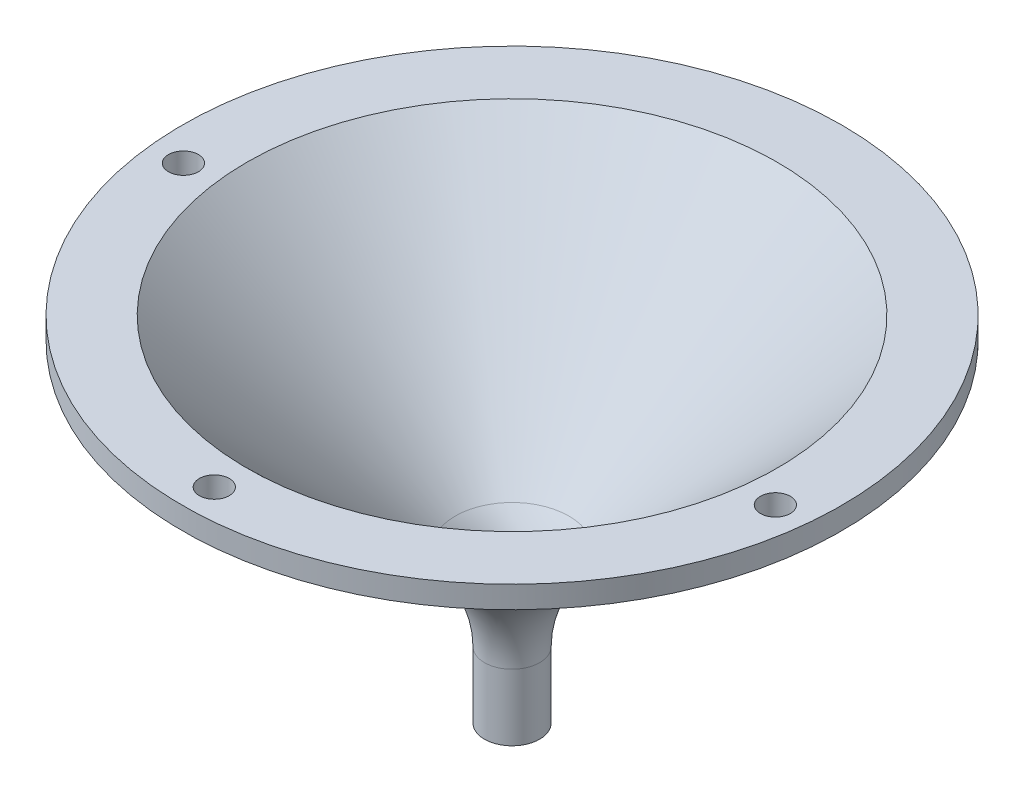
ISO-10303-21;
HEADER;
FILE_DESCRIPTION(('STEP AP214'),'2;1');
FILE_NAME('part.step','',(''),(''),'','','');
FILE_SCHEMA(('AUTOMOTIVE_DESIGN { 1 0 10303 214 1 1 1 1 }'));
ENDSEC;
DATA;
#1=APPLICATION_CONTEXT('core data for automotive mechanical design processes');
#2=APPLICATION_PROTOCOL_DEFINITION('international standard','automotive_design',2000,#1);
#3=PRODUCT_CONTEXT('',#1,'mechanical');
#4=PRODUCT('Part','Part','',(#3));
#5=PRODUCT_RELATED_PRODUCT_CATEGORY('part','',(#4));
#6=PRODUCT_DEFINITION_FORMATION('','',#4);
#7=PRODUCT_DEFINITION_CONTEXT('part definition',#1,'design');
#8=PRODUCT_DEFINITION('design','',#6,#7);
#9=PRODUCT_DEFINITION_SHAPE('','',#8);
#10=(LENGTH_UNIT() NAMED_UNIT(*) SI_UNIT(.MILLI.,.METRE.));
#11=(NAMED_UNIT(*) PLANE_ANGLE_UNIT() SI_UNIT($,.RADIAN.));
#12=(NAMED_UNIT(*) SI_UNIT($,.STERADIAN.) SOLID_ANGLE_UNIT());
#13=UNCERTAINTY_MEASURE_WITH_UNIT(LENGTH_MEASURE(1.E-05),#10,'distance_accuracy_value','');
#14=(GEOMETRIC_REPRESENTATION_CONTEXT(3) GLOBAL_UNCERTAINTY_ASSIGNED_CONTEXT((#13)) GLOBAL_UNIT_ASSIGNED_CONTEXT((#10,
#11,#12)) REPRESENTATION_CONTEXT('',''));
#15=CARTESIAN_POINT('',(0.,0.,0.));
#16=DIRECTION('',(0.,0.,1.));
#17=DIRECTION('',(1.,0.,0.));
#18=AXIS2_PLACEMENT_3D('',#15,#16,#17);
#19=CARTESIAN_POINT('',(3.175,0.,0.));
#20=DIRECTION('',(0.,-1.,0.));
#21=DIRECTION('',(1.,0.,0.));
#22=AXIS2_PLACEMENT_3D('',#19,#20,#21);
#23=PLANE('',#22);
#24=CARTESIAN_POINT('',(0.,0.,0.));
#25=DIRECTION('',(0.,-1.,0.));
#26=DIRECTION('',(1.,0.,0.));
#27=AXIS2_PLACEMENT_3D('',#24,#25,#26);
#28=CIRCLE('',#27,3.175);
#29=CARTESIAN_POINT('',(-0.6,0.,3.11779168643448));
#30=VERTEX_POINT('',#29);
#31=CARTESIAN_POINT('',(-0.600000000000001,0.,-3.11779168643449));
#32=VERTEX_POINT('',#31);
#33=EDGE_CURVE('E48',#30,#32,#28,.T.);
#34=ORIENTED_EDGE('',*,*,#33,.F.);
#35=DIRECTION('',(0.,0.,-1.));
#36=VECTOR('',#35,1.);
#37=CARTESIAN_POINT('',(-0.6,0.,3.92313351321364));
#38=LINE('',#37,#36);
#39=EDGE_CURVE('E82',#30,#32,#38,.T.);
#40=ORIENTED_EDGE('',*,*,#39,.T.);
#41=EDGE_LOOP('',(#34,#40));
#42=FACE_BOUND('',#41,.T.);
#43=CARTESIAN_POINT('',(0.6,0.,-3.11779168643448));
#44=VERTEX_POINT('',#43);
#45=CARTESIAN_POINT('',(0.600000000000001,0.,3.11779168643449));
#46=VERTEX_POINT('',#45);
#47=EDGE_CURVE('E85',#44,#46,#28,.T.);
#48=ORIENTED_EDGE('',*,*,#47,.F.);
#49=DIRECTION('',(0.,0.,1.));
#50=VECTOR('',#49,1.);
#51=CARTESIAN_POINT('',(0.6,0.,3.92313351321364));
#52=LINE('',#51,#50);
#53=EDGE_CURVE('E98',#44,#46,#52,.T.);
#54=ORIENTED_EDGE('',*,*,#53,.T.);
#55=EDGE_LOOP('',(#48,#54));
#56=FACE_BOUND('',#55,.T.);
#57=CARTESIAN_POINT('',(0.,0.,0.));
#58=DIRECTION('',(0.,-1.,0.));
#59=DIRECTION('',(1.,0.,0.));
#60=AXIS2_PLACEMENT_3D('',#57,#58,#59);
#61=CIRCLE('',#60,3.96875);
#62=CARTESIAN_POINT('',(3.96875,0.,0.));
#63=VERTEX_POINT('',#62);
#64=EDGE_CURVE('E140',#63,#63,#61,.T.);
#65=ORIENTED_EDGE('',*,*,#64,.T.);
#66=EDGE_LOOP('',(#65));
#67=FACE_BOUND('',#66,.T.);
#68=ADVANCED_FACE('F39',(#42,#56,#67),#23,.T.);
#69=CARTESIAN_POINT('',(0.,0.,0.));
#70=DIRECTION('',(0.,-1.,0.));
#71=DIRECTION('',(1.,0.,0.));
#72=AXIS2_PLACEMENT_3D('',#69,#70,#71);
#73=CYLINDRICAL_SURFACE('',#72,3.175);
#74=DIRECTION('',(0.,-1.,0.));
#75=VECTOR('',#74,1.);
#76=CARTESIAN_POINT('',(-0.6,0.,3.11779168643448));
#77=LINE('',#76,#75);
#78=CARTESIAN_POINT('',(-0.6,6.35,3.11779168643448));
#79=VERTEX_POINT('',#78);
#80=EDGE_CURVE('E87',#30,#79,#77,.F.);
#81=ORIENTED_EDGE('',*,*,#80,.F.);
#82=ORIENTED_EDGE('',*,*,#33,.T.);
#83=DIRECTION('',(0.,-1.,0.));
#84=VECTOR('',#83,1.);
#85=CARTESIAN_POINT('',(-0.6,0.,-3.11779168643448));
#86=LINE('',#85,#84);
#87=CARTESIAN_POINT('',(-0.6,6.35,-3.11779168643448));
#88=VERTEX_POINT('',#87);
#89=EDGE_CURVE('E94',#88,#32,#86,.T.);
#90=ORIENTED_EDGE('',*,*,#89,.F.);
#91=CARTESIAN_POINT('',(0.,6.35,0.));
#92=DIRECTION('',(0.,-1.,0.));
#93=DIRECTION('',(1.,0.,0.));
#94=AXIS2_PLACEMENT_3D('',#91,#92,#93);
#95=CIRCLE('',#94,3.175);
#96=CARTESIAN_POINT('',(0.6,6.35,-3.11779168643448));
#97=VERTEX_POINT('',#96);
#98=EDGE_CURVE('E108',#88,#97,#95,.T.);
#99=ORIENTED_EDGE('',*,*,#98,.T.);
#100=DIRECTION('',(0.,-1.,0.));
#101=VECTOR('',#100,1.);
#102=CARTESIAN_POINT('',(0.6,0.,-3.11779168643448));
#103=LINE('',#102,#101);
#104=EDGE_CURVE('E111',#44,#97,#103,.F.);
#105=ORIENTED_EDGE('',*,*,#104,.F.);
#106=ORIENTED_EDGE('',*,*,#47,.T.);
#107=DIRECTION('',(0.,-1.,0.));
#108=VECTOR('',#107,1.);
#109=CARTESIAN_POINT('',(0.6,0.,3.11779168643448));
#110=LINE('',#109,#108);
#111=CARTESIAN_POINT('',(0.6,6.35,3.11779168643448));
#112=VERTEX_POINT('',#111);
#113=EDGE_CURVE('E61',#112,#46,#110,.T.);
#114=ORIENTED_EDGE('',*,*,#113,.F.);
#115=EDGE_CURVE('E56',#112,#79,#95,.T.);
#116=ORIENTED_EDGE('',*,*,#115,.T.);
#117=EDGE_LOOP('',(#81,#82,#90,#99,#105,#106,#114,#116));
#118=FACE_BOUND('',#117,.T.);
#119=CARTESIAN_POINT('',(0.,9.87004715977678,0.));
#120=DIRECTION('',(0.,-1.,0.));
#121=DIRECTION('',(1.,0.,0.));
#122=AXIS2_PLACEMENT_3D('',#119,#120,#121);
#123=CIRCLE('',#122,3.17499999999999);
#124=CARTESIAN_POINT('',(3.17499999999999,9.87004715977678,0.));
#125=VERTEX_POINT('',#124);
#126=EDGE_CURVE('E160',#125,#125,#123,.T.);
#127=ORIENTED_EDGE('',*,*,#126,.F.);
#128=EDGE_LOOP('',(#127));
#129=FACE_BOUND('',#128,.T.);
#130=ADVANCED_FACE('F88',(#118,#129),#73,.F.);
#131=CARTESIAN_POINT('',(0.,9.87004715977677,0.));
#132=DIRECTION('',(0.,-1.,0.));
#133=DIRECTION('',(1.,0.,0.));
#134=AXIS2_PLACEMENT_3D('',#131,#132,#133);
#135=TOROIDAL_SURFACE('',#134,19.685,16.51);
#136=ORIENTED_EDGE('',*,*,#126,.T.);
#137=EDGE_LOOP('',(#136));
#138=FACE_BOUND('',#137,.T.);
#139=CARTESIAN_POINT('',(0.,21.7076692280007,0.));
#140=DIRECTION('',(0.,-1.,0.));
#141=DIRECTION('',(1.,0.,0.));
#142=AXIS2_PLACEMENT_3D('',#139,#140,#141);
#143=CIRCLE('',#142,8.17627271285407);
#144=CARTESIAN_POINT('',(-8.17627271285406,21.7076692280007,0.));
#145=VERTEX_POINT('',#144);
#146=EDGE_CURVE('E156',#145,#145,#143,.T.);
#147=ORIENTED_EDGE('',*,*,#146,.F.);
#148=EDGE_LOOP('',(#147));
#149=FACE_BOUND('',#148,.T.);
#150=ADVANCED_FACE('F219',(#138,#149),#135,.T.);
#151=CARTESIAN_POINT('',(0.,50.8,0.));
#152=DIRECTION('',(0.,1.,0.));
#153=DIRECTION('',(-1.,0.,0.));
#154=AXIS2_PLACEMENT_3D('',#151,#152,#153);
#155=CONICAL_SURFACE('',#154,38.1,0.799484863678733);
#156=CARTESIAN_POINT('',(0.,50.8,0.));
#157=DIRECTION('',(0.,-1.,0.));
#158=DIRECTION('',(1.,0.,0.));
#159=AXIS2_PLACEMENT_3D('',#156,#157,#158);
#160=CIRCLE('',#159,38.1);
#161=CARTESIAN_POINT('',(-38.1,50.8,0.));
#162=VERTEX_POINT('',#161);
#163=EDGE_CURVE('E152',#162,#162,#160,.T.);
#164=CARTESIAN_POINT('',(-8.17627271285406,21.7076692280007,0.));
#165=CARTESIAN_POINT('',(-8.4879782054285,22.0107143402091,0.));
#166=CARTESIAN_POINT('',(-8.79968369800294,22.3137594524174,0.));
#167=CARTESIAN_POINT('',(-9.42309468315181,22.919849676834,0.));
#168=CARTESIAN_POINT('',(-9.73480017572625,23.2228947890424,0.));
#169=CARTESIAN_POINT('',(-10.3582111608751,23.828985013459,0.));
#170=CARTESIAN_POINT('',(-10.6699166534496,24.1320301256673,0.));
#171=CARTESIAN_POINT('',(-11.2933276385984,24.738120350084,0.));
#172=CARTESIAN_POINT('',(-11.6050331311729,25.0411654622923,0.));
#173=CARTESIAN_POINT('',(-12.2284441163217,25.647255686709,0.));
#174=CARTESIAN_POINT('',(-12.5401496088962,25.9503007989173,0.));
#175=CARTESIAN_POINT('',(-13.1635605940451,26.556391023334,0.));
#176=CARTESIAN_POINT('',(-13.4752660866195,26.8594361355423,0.));
#177=CARTESIAN_POINT('',(-14.0986770717684,27.4655263599589,0.));
#178=CARTESIAN_POINT('',(-14.4103825643428,27.7685714721673,0.));
#179=CARTESIAN_POINT('',(-15.0337935494917,28.3746616965839,0.));
#180=CARTESIAN_POINT('',(-15.3454990420661,28.6777068087922,0.));
#181=CARTESIAN_POINT('',(-15.968910027215,29.2837970332089,0.));
#182=CARTESIAN_POINT('',(-16.2806155197894,29.5868421454172,0.));
#183=CARTESIAN_POINT('',(-16.9040265049383,30.1929323698339,0.));
#184=CARTESIAN_POINT('',(-17.2157319975127,30.4959774820422,0.));
#185=CARTESIAN_POINT('',(-17.8391429826616,31.1020677064588,0.));
#186=CARTESIAN_POINT('',(-18.150848475236,31.4051128186672,0.));
#187=CARTESIAN_POINT('',(-18.7742594603849,32.0112030430838,0.));
#188=CARTESIAN_POINT('',(-19.0859649529594,32.3142481552921,0.));
#189=CARTESIAN_POINT('',(-19.7093759381082,32.9203383797088,0.));
#190=CARTESIAN_POINT('',(-20.0210814306827,33.2233834919171,0.));
#191=CARTESIAN_POINT('',(-20.6444924158315,33.8294737163338,0.));
#192=CARTESIAN_POINT('',(-20.956197908406,34.1325188285421,0.));
#193=CARTESIAN_POINT('',(-21.5796088935549,34.7386090529587,0.));
#194=CARTESIAN_POINT('',(-21.8913143861293,35.0416541651671,0.));
#195=CARTESIAN_POINT('',(-22.5147253712782,35.6477443895837,0.));
#196=CARTESIAN_POINT('',(-22.8264308638526,35.950789501792,0.));
#197=CARTESIAN_POINT('',(-23.4498418490015,36.5568797262087,0.));
#198=CARTESIAN_POINT('',(-23.7615473415759,36.859924838417,0.));
#199=CARTESIAN_POINT('',(-24.3849583267248,37.4660150628337,0.));
#200=CARTESIAN_POINT('',(-24.6966638192992,37.769060175042,0.));
#201=CARTESIAN_POINT('',(-25.3200748044481,38.3751503994586,0.));
#202=CARTESIAN_POINT('',(-25.6317802970225,38.678195511667,0.));
#203=CARTESIAN_POINT('',(-26.2551912821714,39.2842857360836,0.));
#204=CARTESIAN_POINT('',(-26.5668967747458,39.587330848292,0.));
#205=CARTESIAN_POINT('',(-27.1903077598947,40.1934210727086,0.));
#206=CARTESIAN_POINT('',(-27.5020132524692,40.4964661849169,0.));
#207=CARTESIAN_POINT('',(-28.125424237618,41.1025564093336,0.));
#208=CARTESIAN_POINT('',(-28.4371297301925,41.4056015215419,0.));
#209=CARTESIAN_POINT('',(-29.0605407153413,42.0116917459586,0.));
#210=CARTESIAN_POINT('',(-29.3722462079158,42.3147368581669,0.));
#211=CARTESIAN_POINT('',(-29.9956571930646,42.9208270825835,0.));
#212=CARTESIAN_POINT('',(-30.3073626856391,43.2238721947919,0.));
#213=CARTESIAN_POINT('',(-30.930773670788,43.8299624192085,0.));
#214=CARTESIAN_POINT('',(-31.2424791633624,44.1330075314168,0.));
#215=CARTESIAN_POINT('',(-31.8658901485113,44.7390977558335,0.));
#216=CARTESIAN_POINT('',(-32.1775956410857,45.0421428680418,0.));
#217=CARTESIAN_POINT('',(-32.8010066262346,45.6482330924585,0.));
#218=CARTESIAN_POINT('',(-33.112712118809,45.9512782046668,0.));
#219=CARTESIAN_POINT('',(-33.7361231039579,46.5573684290834,0.));
#220=CARTESIAN_POINT('',(-34.0478285965323,46.8604135412918,0.));
#221=CARTESIAN_POINT('',(-34.6712395816812,47.4665037657084,0.));
#222=CARTESIAN_POINT('',(-34.9829450742556,47.7695488779167,0.));
#223=CARTESIAN_POINT('',(-35.6063560594045,48.3756391023334,0.));
#224=CARTESIAN_POINT('',(-35.918061551979,48.6786842145417,0.));
#225=CARTESIAN_POINT('',(-36.5414725371278,49.2847744389584,0.));
#226=CARTESIAN_POINT('',(-36.8531780297023,49.5878195511667,0.));
#227=CARTESIAN_POINT('',(-37.4765890148511,50.1939097755834,0.));
#228=CARTESIAN_POINT('',(-37.7882945074256,50.4969548877917,0.));
#229=CARTESIAN_POINT('',(-38.1,50.8,0.));
#230=B_SPLINE_CURVE_WITH_KNOTS('',3,(#164,#165,#166,#167,#168,#169,#170,#171,#172,#173,#174,
#175,#176,#177,#178,#179,#180,#181,#182,#183,#184,#185,#186,#187,#188,#189,#190,#191,#192,#193,
#194,#195,#196,#197,#198,#199,#200,#201,#202,#203,#204,#205,#206,#207,#208,#209,#210,#211,#212,
#213,#214,#215,#216,#217,#218,#219,#220,#221,#222,#223,#224,#225,#226,#227,#228,#229),
.UNSPECIFIED.,.F.,.F.,(4,2,2,2,2,2,2,2,2,2,2,2,2,2,2,2,2,2,2,2,2,2,2,2,2,2,2,2,2,2,2,2,4),(0.,
1.30421236277297,2.60842472554594,3.91263708831892,5.21684945109189,6.52106181386486,
7.82527417663784,9.12948653941081,10.4336989021838,11.7379112649568,13.0421236277297,
14.3463359905027,15.6505483532757,16.9547607160486,18.2589730788216,19.5631854415946,
20.8673978043676,22.1716101671405,23.4758225299135,24.7800348926865,26.0842472554595,
27.3884596182324,28.6926719810054,29.9968843437784,31.3010967065514,32.6053090693243,
33.9095214320973,35.2137337948703,36.5179461576432,37.8221585204162,39.1263708831892,
40.4305832459622,41.7347956087351),.UNSPECIFIED.);
#231=EDGE_CURVE('BSEAM223',#145,#162,#230,.T.);
#232=ORIENTED_EDGE('',*,*,#146,.T.);
#233=ORIENTED_EDGE('',*,*,#163,.F.);
#234=ORIENTED_EDGE('',*,*,#231,.T.);
#235=ORIENTED_EDGE('',*,*,#231,.F.);
#236=EDGE_LOOP('',(#232,#234,#233,#235));
#237=FACE_BOUND('',#236,.T.);
#238=ADVANCED_FACE('F223',(#237),#155,.F.);
#239=CARTESIAN_POINT('',(39.238684771394,50.8,0.));
#240=DIRECTION('',(0.,1.,0.));
#241=DIRECTION('',(-1.,0.,0.));
#242=AXIS2_PLACEMENT_3D('',#239,#240,#241);
#243=PLANE('',#242);
#244=CARTESIAN_POINT('',(0.,50.8,42.794684771394));
#245=DIRECTION('',(0.,1.,0.));
#246=DIRECTION('',(-1.,0.,0.));
#247=AXIS2_PLACEMENT_3D('',#244,#245,#246);
#248=CIRCLE('',#247,2.15);
#249=CARTESIAN_POINT('',(-2.15,50.8,42.794684771394));
#250=VERTEX_POINT('',#249);
#251=EDGE_CURVE('E120',#250,#250,#248,.T.);
#252=ORIENTED_EDGE('',*,*,#251,.F.);
#253=EDGE_LOOP('',(#252));
#254=FACE_BOUND('',#253,.T.);
#255=CARTESIAN_POINT('',(-42.5363959401854,50.8,4.69468477139402));
#256=DIRECTION('',(0.,1.,0.));
#257=DIRECTION('',(-1.,0.,0.));
#258=AXIS2_PLACEMENT_3D('',#255,#256,#257);
#259=CIRCLE('',#258,2.15);
#260=CARTESIAN_POINT('',(-44.6863959401854,50.8,4.69468477139402));
#261=VERTEX_POINT('',#260);
#262=EDGE_CURVE('E125',#261,#261,#259,.T.);
#263=ORIENTED_EDGE('',*,*,#262,.F.);
#264=EDGE_LOOP('',(#263));
#265=FACE_BOUND('',#264,.T.);
#266=CARTESIAN_POINT('',(42.5363959401854,50.8,4.69468477139402));
#267=DIRECTION('',(0.,1.,0.));
#268=DIRECTION('',(-1.,0.,0.));
#269=AXIS2_PLACEMENT_3D('',#266,#267,#268);
#270=CIRCLE('',#269,2.15);
#271=CARTESIAN_POINT('',(40.3863959401854,50.8,4.69468477139402));
#272=VERTEX_POINT('',#271);
#273=EDGE_CURVE('E119',#272,#272,#270,.T.);
#274=ORIENTED_EDGE('',*,*,#273,.F.);
#275=EDGE_LOOP('',(#274));
#276=FACE_BOUND('',#275,.T.);
#277=ORIENTED_EDGE('',*,*,#163,.T.);
#278=EDGE_LOOP('',(#277));
#279=FACE_BOUND('',#278,.T.);
#280=CARTESIAN_POINT('',(0.,50.8,0.));
#281=DIRECTION('',(0.,-1.,0.));
#282=DIRECTION('',(0.,0.,-1.));
#283=AXIS2_PLACEMENT_3D('',#280,#281,#282);
#284=CIRCLE('',#283,47.366684771394);
#285=CARTESIAN_POINT('',(0.,50.8,-47.366684771394));
#286=VERTEX_POINT('',#285);
#287=EDGE_CURVE('E136',#286,#286,#284,.T.);
#288=ORIENTED_EDGE('',*,*,#287,.F.);
#289=EDGE_LOOP('',(#288));
#290=FACE_BOUND('',#289,.T.);
#291=ADVANCED_FACE('F196',(#254,#265,#276,#279,#290),#243,.T.);
#292=CARTESIAN_POINT('',(0.,21.3723180744541,0.));
#293=DIRECTION('',(0.,1.,0.));
#294=DIRECTION('',(-1.,0.,0.));
#295=AXIS2_PLACEMENT_3D('',#292,#293,#294);
#296=CONICAL_SURFACE('',#295,8.97002271285407,0.799484863678733);
#297=CARTESIAN_POINT('',(0.,47.625,0.));
#298=DIRECTION('',(0.,-1.,0.));
#299=DIRECTION('',(0.,0.,-1.));
#300=AXIS2_PLACEMENT_3D('',#297,#298,#299);
#301=CIRCLE('',#300,35.972950070339);
#302=CARTESIAN_POINT('',(-35.972950070339,47.625,0.));
#303=VERTEX_POINT('',#302);
#304=EDGE_CURVE('E11',#303,#303,#301,.F.);
#305=CARTESIAN_POINT('',(0.,21.3723180744541,0.));
#306=DIRECTION('',(0.,-1.,0.));
#307=DIRECTION('',(1.,0.,0.));
#308=AXIS2_PLACEMENT_3D('',#305,#306,#307);
#309=CIRCLE('',#308,8.97002271285407);
#310=CARTESIAN_POINT('',(-8.97002271285407,21.3723180744541,0.));
#311=VERTEX_POINT('',#310);
#312=EDGE_CURVE('E148',#311,#311,#309,.T.);
#313=CARTESIAN_POINT('',(-35.972950070339,47.625,0.));
#314=CARTESIAN_POINT('',(-35.6916695770319,47.3515345632756,0.));
#315=CARTESIAN_POINT('',(-35.4103890837248,47.0780691265511,0.));
#316=CARTESIAN_POINT('',(-34.8478280971105,46.5311382531023,0.));
#317=CARTESIAN_POINT('',(-34.5665476038034,46.2576728163778,0.));
#318=CARTESIAN_POINT('',(-34.0039866171891,45.7107419429289,0.));
#319=CARTESIAN_POINT('',(-33.7227061238819,45.4372765062045,0.));
#320=CARTESIAN_POINT('',(-33.1601451372677,44.8903456327556,0.));
#321=CARTESIAN_POINT('',(-32.8788646439605,44.6168801960312,0.));
#322=CARTESIAN_POINT('',(-32.3163036573463,44.0699493225823,0.));
#323=CARTESIAN_POINT('',(-32.0350231640391,43.7964838858579,0.));
#324=CARTESIAN_POINT('',(-31.4724621774249,43.249553012409,0.));
#325=CARTESIAN_POINT('',(-31.1911816841177,42.9760875756846,0.));
#326=CARTESIAN_POINT('',(-30.6286206975035,42.4291567022357,0.));
#327=CARTESIAN_POINT('',(-30.3473402041963,42.1556912655113,0.));
#328=CARTESIAN_POINT('',(-29.7847792175821,41.6087603920624,0.));
#329=CARTESIAN_POINT('',(-29.5034987242749,41.335294955338,0.));
#330=CARTESIAN_POINT('',(-28.9409377376607,40.7883640818891,0.));
#331=CARTESIAN_POINT('',(-28.6596572443535,40.5148986451646,0.));
#332=CARTESIAN_POINT('',(-28.0970962577393,39.9679677717158,0.));
#333=CARTESIAN_POINT('',(-27.8158157644321,39.6945023349913,0.));
#334=CARTESIAN_POINT('',(-27.2532547778178,39.1475714615425,0.));
#335=CARTESIAN_POINT('',(-26.9719742845107,38.874106024818,0.));
#336=CARTESIAN_POINT('',(-26.4094132978964,38.3271751513692,0.));
#337=CARTESIAN_POINT('',(-26.1281328045893,38.0537097146447,0.));
#338=CARTESIAN_POINT('',(-25.565571817975,37.5067788411959,0.));
#339=CARTESIAN_POINT('',(-25.2842913246679,37.2333134044714,0.));
#340=CARTESIAN_POINT('',(-24.7217303380536,36.6863825310225,0.));
#341=CARTESIAN_POINT('',(-24.4404498447465,36.4129170942981,0.));
#342=CARTESIAN_POINT('',(-23.8778888581322,35.8659862208492,0.));
#343=CARTESIAN_POINT('',(-23.5966083648251,35.5925207841248,0.));
#344=CARTESIAN_POINT('',(-23.0340473782108,35.0455899106759,0.));
#345=CARTESIAN_POINT('',(-22.7527668849037,34.7721244739515,0.));
#346=CARTESIAN_POINT('',(-22.1902058982894,34.2251936005026,0.));
#347=CARTESIAN_POINT('',(-21.9089254049823,33.9517281637782,0.));
#348=CARTESIAN_POINT('',(-21.346364418368,33.4047972903293,0.));
#349=CARTESIAN_POINT('',(-21.0650839250609,33.1313318536049,0.));
#350=CARTESIAN_POINT('',(-20.5025229384466,32.584400980156,0.));
#351=CARTESIAN_POINT('',(-20.2212424451395,32.3109355434316,0.));
#352=CARTESIAN_POINT('',(-19.6586814585252,31.7640046699827,0.));
#353=CARTESIAN_POINT('',(-19.3774009652181,31.4905392332583,0.));
#354=CARTESIAN_POINT('',(-18.8148399786038,30.9436083598094,0.));
#355=CARTESIAN_POINT('',(-18.5335594852967,30.6701429230849,0.));
#356=CARTESIAN_POINT('',(-17.9709984986824,30.1232120496361,0.));
#357=CARTESIAN_POINT('',(-17.6897180053753,29.8497466129116,0.));
#358=CARTESIAN_POINT('',(-17.127157018761,29.3028157394628,0.));
#359=CARTESIAN_POINT('',(-16.8458765254539,29.0293503027383,0.));
#360=CARTESIAN_POINT('',(-16.2833155388396,28.4824194292894,0.));
#361=CARTESIAN_POINT('',(-16.0020350455325,28.208953992565,0.));
#362=CARTESIAN_POINT('',(-15.4394740589182,27.6620231191161,0.));
#363=CARTESIAN_POINT('',(-15.158193565611,27.3885576823917,0.));
#364=CARTESIAN_POINT('',(-14.5956325789968,26.8416268089428,0.));
#365=CARTESIAN_POINT('',(-14.3143520856896,26.5681613722184,0.));
#366=CARTESIAN_POINT('',(-13.7517910990754,26.0212304987695,0.));
#367=CARTESIAN_POINT('',(-13.4705106057682,25.7477650620451,0.));
#368=CARTESIAN_POINT('',(-12.907949619154,25.2008341885962,0.));
#369=CARTESIAN_POINT('',(-12.6266691258468,24.9273687518718,0.));
#370=CARTESIAN_POINT('',(-12.0641081392326,24.3804378784229,0.));
#371=CARTESIAN_POINT('',(-11.7828276459254,24.1069724416985,0.));
#372=CARTESIAN_POINT('',(-11.2202666593112,23.5600415682496,0.));
#373=CARTESIAN_POINT('',(-10.938986166004,23.2865761315252,0.));
#374=CARTESIAN_POINT('',(-10.3764251793898,22.7396452580763,0.));
#375=CARTESIAN_POINT('',(-10.0951446860826,22.4661798213518,0.));
#376=CARTESIAN_POINT('',(-9.53258369946835,21.919248947903,0.));
#377=CARTESIAN_POINT('',(-9.25130320616121,21.6457835111785,0.));
#378=CARTESIAN_POINT('',(-8.97002271285408,21.3723180744541,0.));
#379=B_SPLINE_CURVE_WITH_KNOTS('',3,(#313,#314,#315,#316,#317,#318,#319,#320,#321,#322,#323,
#324,#325,#326,#327,#328,#329,#330,#331,#332,#333,#334,#335,#336,#337,#338,#339,#340,#341,#342,
#343,#344,#345,#346,#347,#348,#349,#350,#351,#352,#353,#354,#355,#356,#357,#358,#359,#360,#361,
#362,#363,#364,#365,#366,#367,#368,#369,#370,#371,#372,#373,#374,#375,#376,#377,#378),
.UNSPECIFIED.,.F.,.F.,(4,2,2,2,2,2,2,2,2,2,2,2,2,2,2,2,2,2,2,2,2,2,2,2,2,2,2,2,2,2,2,2,4),(0.,
1.17691059515238,2.35382119030476,3.53073178545714,4.70764238060951,5.88455297576189,
7.06146357091428,8.23837416606665,9.41528476121903,10.5921953563714,11.7691059515238,
12.9460165466762,14.1229271418286,15.2998377369809,16.4767483321333,17.6536589272857,
18.8305695224381,20.0074801175905,21.1843907127428,22.3613013078952,23.5382119030476,
24.7151224982,25.8920330933523,27.0689436885047,28.2458542836571,29.4227648788095,
30.5996754739619,31.7765860691142,32.9534966642666,34.130407259419,35.3073178545714,
36.4842284497238,37.6611390448761),.UNSPECIFIED.);
#380=EDGE_CURVE('BSEAM192',#303,#311,#379,.T.);
#381=ORIENTED_EDGE('',*,*,#304,.F.);
#382=ORIENTED_EDGE('',*,*,#312,.F.);
#383=ORIENTED_EDGE('',*,*,#380,.T.);
#384=ORIENTED_EDGE('',*,*,#380,.F.);
#385=EDGE_LOOP('',(#381,#383,#382,#384));
#386=FACE_BOUND('',#385,.T.);
#387=ADVANCED_FACE('F192',(#386),#296,.T.);
#388=CARTESIAN_POINT('',(0.,9.53469600623014,0.));
#389=DIRECTION('',(0.,-1.,0.));
#390=DIRECTION('',(1.,0.,0.));
#391=AXIS2_PLACEMENT_3D('',#388,#389,#390);
#392=TOROIDAL_SURFACE('',#391,20.47875,16.51);
#393=ORIENTED_EDGE('',*,*,#312,.T.);
#394=EDGE_LOOP('',(#393));
#395=FACE_BOUND('',#394,.T.);
#396=CARTESIAN_POINT('',(0.,9.53469600623014,0.));
#397=DIRECTION('',(0.,-1.,0.));
#398=DIRECTION('',(1.,0.,0.));
#399=AXIS2_PLACEMENT_3D('',#396,#397,#398);
#400=CIRCLE('',#399,3.96875);
#401=CARTESIAN_POINT('',(3.96875,9.53469600623014,0.));
#402=VERTEX_POINT('',#401);
#403=EDGE_CURVE('E144',#402,#402,#400,.T.);
#404=ORIENTED_EDGE('',*,*,#403,.F.);
#405=EDGE_LOOP('',(#404));
#406=FACE_BOUND('',#405,.T.);
#407=ADVANCED_FACE('F195',(#395,#406),#392,.F.);
#408=CARTESIAN_POINT('',(0.,0.,0.));
#409=DIRECTION('',(0.,-1.,0.));
#410=DIRECTION('',(1.,0.,0.));
#411=AXIS2_PLACEMENT_3D('',#408,#409,#410);
#412=CYLINDRICAL_SURFACE('',#411,3.96875);
#413=ORIENTED_EDGE('',*,*,#64,.F.);
#414=EDGE_LOOP('',(#413));
#415=FACE_BOUND('',#414,.T.);
#416=ORIENTED_EDGE('',*,*,#403,.T.);
#417=EDGE_LOOP('',(#416));
#418=FACE_BOUND('',#417,.T.);
#419=ADVANCED_FACE('F202',(#415,#418),#412,.T.);
#420=CARTESIAN_POINT('',(0.,0.,0.));
#421=DIRECTION('',(0.,-1.,0.));
#422=DIRECTION('',(0.,0.,-1.));
#423=AXIS2_PLACEMENT_3D('',#420,#421,#422);
#424=CYLINDRICAL_SURFACE('',#423,47.366684771394);
#425=ORIENTED_EDGE('',*,*,#287,.T.);
#426=EDGE_LOOP('',(#425));
#427=FACE_BOUND('',#426,.T.);
#428=CARTESIAN_POINT('',(0.,47.625,0.));
#429=DIRECTION('',(0.,-1.,0.));
#430=DIRECTION('',(0.,0.,-1.));
#431=AXIS2_PLACEMENT_3D('',#428,#429,#430);
#432=CIRCLE('',#431,47.366684771394);
#433=CARTESIAN_POINT('',(0.,47.625,-47.366684771394));
#434=VERTEX_POINT('',#433);
#435=EDGE_CURVE('E132',#434,#434,#432,.T.);
#436=ORIENTED_EDGE('',*,*,#435,.F.);
#437=EDGE_LOOP('',(#436));
#438=FACE_BOUND('',#437,.T.);
#439=ADVANCED_FACE('F183',(#427,#438),#424,.T.);
#440=CARTESIAN_POINT('',(47.366684771394,47.625,0.));
#441=DIRECTION('',(0.,-1.,0.));
#442=DIRECTION('',(0.,0.,-1.));
#443=AXIS2_PLACEMENT_3D('',#440,#441,#442);
#444=PLANE('',#443);
#445=CARTESIAN_POINT('',(0.,47.625,42.794684771394));
#446=DIRECTION('',(0.,-1.,0.));
#447=DIRECTION('',(0.,0.,-1.));
#448=AXIS2_PLACEMENT_3D('',#445,#446,#447);
#449=CIRCLE('',#448,2.15);
#450=CARTESIAN_POINT('',(0.,47.625,40.644684771394));
#451=VERTEX_POINT('',#450);
#452=EDGE_CURVE('E42',#451,#451,#449,.T.);
#453=ORIENTED_EDGE('',*,*,#452,.F.);
#454=EDGE_LOOP('',(#453));
#455=FACE_BOUND('',#454,.T.);
#456=CARTESIAN_POINT('',(-42.5363959401854,47.625,4.69468477139402));
#457=DIRECTION('',(0.,-1.,0.));
#458=DIRECTION('',(0.,0.,-1.));
#459=AXIS2_PLACEMENT_3D('',#456,#457,#458);
#460=CIRCLE('',#459,2.15);
#461=CARTESIAN_POINT('',(-42.5363959401854,47.625,2.54468477139402));
#462=VERTEX_POINT('',#461);
#463=EDGE_CURVE('E167',#462,#462,#460,.T.);
#464=ORIENTED_EDGE('',*,*,#463,.F.);
#465=EDGE_LOOP('',(#464));
#466=FACE_BOUND('',#465,.T.);
#467=CARTESIAN_POINT('',(42.5363959401854,47.625,4.69468477139402));
#468=DIRECTION('',(0.,-1.,0.));
#469=DIRECTION('',(0.,0.,-1.));
#470=AXIS2_PLACEMENT_3D('',#467,#468,#469);
#471=CIRCLE('',#470,2.15);
#472=CARTESIAN_POINT('',(42.5363959401854,47.625,2.54468477139402));
#473=VERTEX_POINT('',#472);
#474=EDGE_CURVE('E124',#473,#473,#471,.T.);
#475=ORIENTED_EDGE('',*,*,#474,.F.);
#476=EDGE_LOOP('',(#475));
#477=FACE_BOUND('',#476,.T.);
#478=ORIENTED_EDGE('',*,*,#435,.T.);
#479=EDGE_LOOP('',(#478));
#480=FACE_BOUND('',#479,.T.);
#481=ORIENTED_EDGE('',*,*,#304,.T.);
#482=EDGE_LOOP('',(#481));
#483=FACE_BOUND('',#482,.T.);
#484=ADVANCED_FACE('F179',(#455,#466,#477,#480,#483),#444,.T.);
#485=CARTESIAN_POINT('',(42.5363959401854,0.,4.69468477139402));
#486=DIRECTION('',(0.,1.,0.));
#487=DIRECTION('',(-1.,0.,0.));
#488=AXIS2_PLACEMENT_3D('',#485,#486,#487);
#489=CYLINDRICAL_SURFACE('',#488,2.15);
#490=ORIENTED_EDGE('',*,*,#474,.T.);
#491=EDGE_LOOP('',(#490));
#492=FACE_BOUND('',#491,.T.);
#493=ORIENTED_EDGE('',*,*,#273,.T.);
#494=EDGE_LOOP('',(#493));
#495=FACE_BOUND('',#494,.T.);
#496=ADVANCED_FACE('F182',(#492,#495),#489,.F.);
#497=CARTESIAN_POINT('',(-42.5363959401854,0.,4.69468477139402));
#498=DIRECTION('',(0.,1.,0.));
#499=DIRECTION('',(-1.,0.,0.));
#500=AXIS2_PLACEMENT_3D('',#497,#498,#499);
#501=CYLINDRICAL_SURFACE('',#500,2.15);
#502=ORIENTED_EDGE('',*,*,#463,.T.);
#503=EDGE_LOOP('',(#502));
#504=FACE_BOUND('',#503,.T.);
#505=ORIENTED_EDGE('',*,*,#262,.T.);
#506=EDGE_LOOP('',(#505));
#507=FACE_BOUND('',#506,.T.);
#508=ADVANCED_FACE('F247',(#504,#507),#501,.F.);
#509=CARTESIAN_POINT('',(0.,0.,42.794684771394));
#510=DIRECTION('',(0.,1.,0.));
#511=DIRECTION('',(-1.,0.,0.));
#512=AXIS2_PLACEMENT_3D('',#509,#510,#511);
#513=CYLINDRICAL_SURFACE('',#512,2.15);
#514=ORIENTED_EDGE('',*,*,#452,.T.);
#515=EDGE_LOOP('',(#514));
#516=FACE_BOUND('',#515,.T.);
#517=ORIENTED_EDGE('',*,*,#251,.T.);
#518=EDGE_LOOP('',(#517));
#519=FACE_BOUND('',#518,.T.);
#520=ADVANCED_FACE('F176',(#516,#519),#513,.F.);
#521=CARTESIAN_POINT('',(-0.6,6.35,3.92313351321364));
#522=DIRECTION('',(-1.,0.,0.));
#523=DIRECTION('',(0.,-1.,0.));
#524=AXIS2_PLACEMENT_3D('',#521,#522,#523);
#525=PLANE('',#524);
#526=DIRECTION('',(0.,0.,-1.));
#527=VECTOR('',#526,1.);
#528=CARTESIAN_POINT('',(-0.6,6.35,3.92313351321364));
#529=LINE('',#528,#527);
#530=EDGE_CURVE('E102',#79,#88,#529,.T.);
#531=ORIENTED_EDGE('',*,*,#530,.T.);
#532=ORIENTED_EDGE('',*,*,#89,.T.);
#533=ORIENTED_EDGE('',*,*,#39,.F.);
#534=ORIENTED_EDGE('',*,*,#80,.T.);
#535=EDGE_LOOP('',(#531,#532,#533,#534));
#536=FACE_BOUND('',#535,.T.);
#537=ADVANCED_FACE('F96',(#536),#525,.T.);
#538=CARTESIAN_POINT('',(0.6,6.35,3.92313351321364));
#539=DIRECTION('',(1.,0.,0.));
#540=DIRECTION('',(0.,1.,0.));
#541=AXIS2_PLACEMENT_3D('',#538,#539,#540);
#542=PLANE('',#541);
#543=DIRECTION('',(0.,0.,1.));
#544=VECTOR('',#543,1.);
#545=CARTESIAN_POINT('',(0.6,6.35,3.92313351321364));
#546=LINE('',#545,#544);
#547=EDGE_CURVE('E105',#97,#112,#546,.T.);
#548=ORIENTED_EDGE('',*,*,#547,.T.);
#549=ORIENTED_EDGE('',*,*,#113,.T.);
#550=ORIENTED_EDGE('',*,*,#53,.F.);
#551=ORIENTED_EDGE('',*,*,#104,.T.);
#552=EDGE_LOOP('',(#548,#549,#550,#551));
#553=FACE_BOUND('',#552,.T.);
#554=ADVANCED_FACE('F259',(#553),#542,.T.);
#555=CARTESIAN_POINT('',(0.,6.35,0.));
#556=DIRECTION('',(0.,-1.,0.));
#557=DIRECTION('',(1.,0.,0.));
#558=AXIS2_PLACEMENT_3D('',#555,#556,#557);
#559=PLANE('',#558);
#560=ORIENTED_EDGE('',*,*,#115,.F.);
#561=ORIENTED_EDGE('',*,*,#547,.F.);
#562=ORIENTED_EDGE('',*,*,#98,.F.);
#563=ORIENTED_EDGE('',*,*,#530,.F.);
#564=EDGE_LOOP('',(#560,#561,#562,#563));
#565=FACE_BOUND('',#564,.T.);
#566=ADVANCED_FACE('F262',(#565),#559,.F.);
#567=CLOSED_SHELL('',(#68,#130,#150,#238,#291,#387,#407,#419,#439,#484,#496,#508,#520,#537,#554,#566));
#568=MANIFOLD_SOLID_BREP('B2',#567);
#569=ADVANCED_BREP_SHAPE_REPRESENTATION('',(#18,#568),#14);
#570=SHAPE_DEFINITION_REPRESENTATION(#9,#569);
ENDSEC;
END-ISO-10303-21;
